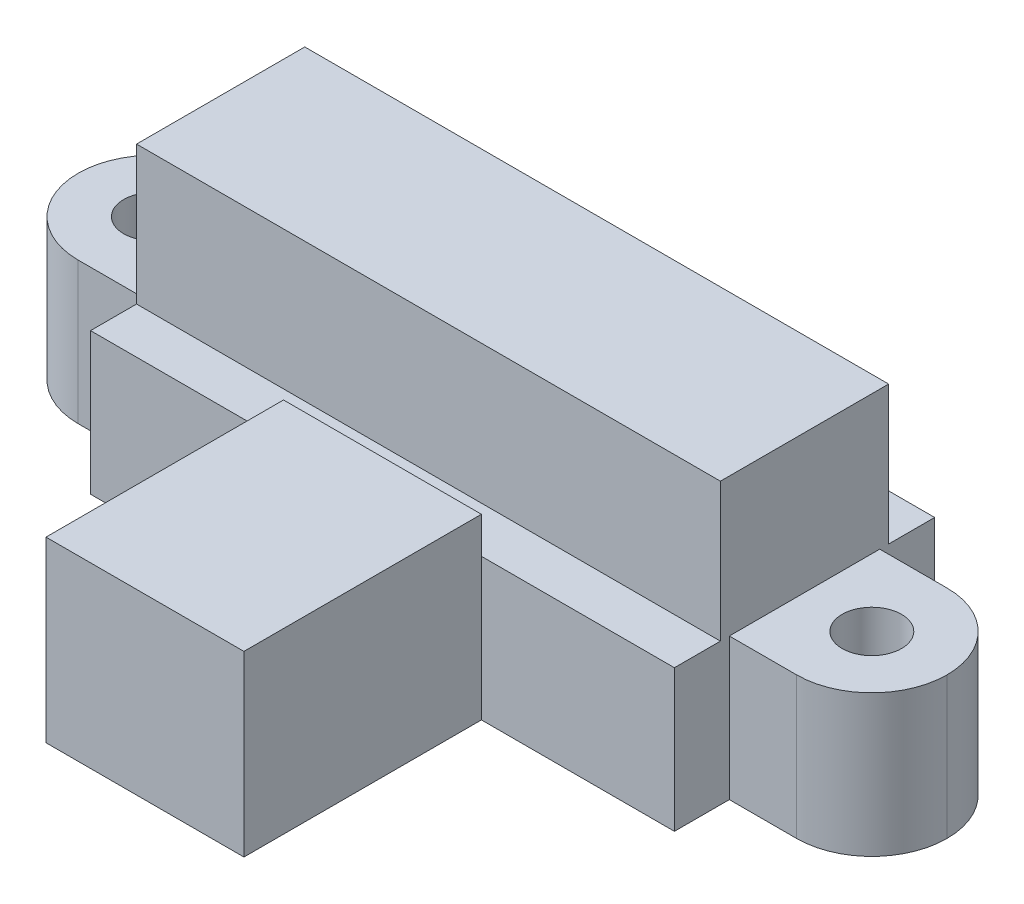
ISO-10303-21;
HEADER;
FILE_DESCRIPTION(('STEP AP214'),'2;1');
FILE_NAME('part.step','',(''),(''),'','','');
FILE_SCHEMA(('AUTOMOTIVE_DESIGN { 1 0 10303 214 1 1 1 1 }'));
ENDSEC;
DATA;
#1=APPLICATION_CONTEXT('core data for automotive mechanical design processes');
#2=APPLICATION_PROTOCOL_DEFINITION('international standard','automotive_design',2000,#1);
#3=PRODUCT_CONTEXT('',#1,'mechanical');
#4=PRODUCT('Part','Part','',(#3));
#5=PRODUCT_RELATED_PRODUCT_CATEGORY('part','',(#4));
#6=PRODUCT_DEFINITION_FORMATION('','',#4);
#7=PRODUCT_DEFINITION_CONTEXT('part definition',#1,'design');
#8=PRODUCT_DEFINITION('design','',#6,#7);
#9=PRODUCT_DEFINITION_SHAPE('','',#8);
#10=(LENGTH_UNIT() NAMED_UNIT(*) SI_UNIT(.MILLI.,.METRE.));
#11=(NAMED_UNIT(*) PLANE_ANGLE_UNIT() SI_UNIT($,.RADIAN.));
#12=(NAMED_UNIT(*) SI_UNIT($,.STERADIAN.) SOLID_ANGLE_UNIT());
#13=UNCERTAINTY_MEASURE_WITH_UNIT(LENGTH_MEASURE(1.E-05),#10,'distance_accuracy_value','');
#14=(GEOMETRIC_REPRESENTATION_CONTEXT(3) GLOBAL_UNCERTAINTY_ASSIGNED_CONTEXT((#13)) GLOBAL_UNIT_ASSIGNED_CONTEXT((#10,
#11,#12)) REPRESENTATION_CONTEXT('',''));
#15=CARTESIAN_POINT('',(0.,0.,0.));
#16=DIRECTION('',(0.,0.,1.));
#17=DIRECTION('',(1.,0.,0.));
#18=AXIS2_PLACEMENT_3D('',#15,#16,#17);
#19=CARTESIAN_POINT('',(-5.,0.,18.575));
#20=DIRECTION('',(0.,1.,0.));
#21=DIRECTION('',(0.,0.,1.));
#22=AXIS2_PLACEMENT_3D('',#19,#20,#21);
#23=PLANE('',#22);
#24=DIRECTION('',(1.,0.,0.));
#25=VECTOR('',#24,1.);
#26=CARTESIAN_POINT('',(-5.,0.,6.575));
#27=LINE('',#26,#25);
#28=CARTESIAN_POINT('',(-5.,0.,6.575));
#29=VERTEX_POINT('',#28);
#30=CARTESIAN_POINT('',(5.,0.,6.575));
#31=VERTEX_POINT('',#30);
#32=EDGE_CURVE('E105',#29,#31,#27,.T.);
#33=ORIENTED_EDGE('',*,*,#32,.T.);
#34=DIRECTION('',(0.,0.,-1.));
#35=VECTOR('',#34,1.);
#36=CARTESIAN_POINT('',(5.,0.,18.575));
#37=LINE('',#36,#35);
#38=CARTESIAN_POINT('',(5.,0.,18.575));
#39=VERTEX_POINT('',#38);
#40=EDGE_CURVE('E12',#39,#31,#37,.T.);
#41=ORIENTED_EDGE('',*,*,#40,.F.);
#42=DIRECTION('',(1.,0.,0.));
#43=VECTOR('',#42,1.);
#44=CARTESIAN_POINT('',(-5.,0.,18.575));
#45=LINE('',#44,#43);
#46=CARTESIAN_POINT('',(-5.,0.,18.575));
#47=VERTEX_POINT('',#46);
#48=EDGE_CURVE('E93',#47,#39,#45,.T.);
#49=ORIENTED_EDGE('',*,*,#48,.F.);
#50=DIRECTION('',(0.,0.,-1.));
#51=VECTOR('',#50,1.);
#52=CARTESIAN_POINT('',(-5.,0.,18.575));
#53=LINE('',#52,#51);
#54=EDGE_CURVE('E101',#47,#29,#53,.T.);
#55=ORIENTED_EDGE('',*,*,#54,.T.);
#56=EDGE_LOOP('',(#33,#41,#49,#55));
#57=FACE_BOUND('',#56,.T.);
#58=ADVANCED_FACE('F42',(#57),#23,.F.);
#59=CARTESIAN_POINT('',(5.,0.,18.575));
#60=DIRECTION('',(-1.,0.,0.));
#61=DIRECTION('',(0.,0.,1.));
#62=AXIS2_PLACEMENT_3D('',#59,#60,#61);
#63=PLANE('',#62);
#64=DIRECTION('',(0.,1.,0.));
#65=VECTOR('',#64,1.);
#66=CARTESIAN_POINT('',(5.,0.,6.575));
#67=LINE('',#66,#65);
#68=CARTESIAN_POINT('',(5.,9.,6.575));
#69=VERTEX_POINT('',#68);
#70=EDGE_CURVE('E97',#31,#69,#67,.T.);
#71=ORIENTED_EDGE('',*,*,#70,.T.);
#72=DIRECTION('',(0.,0.,-1.));
#73=VECTOR('',#72,1.);
#74=CARTESIAN_POINT('',(5.,9.,18.575));
#75=LINE('',#74,#73);
#76=CARTESIAN_POINT('',(5.,9.,18.575));
#77=VERTEX_POINT('',#76);
#78=EDGE_CURVE('E50',#77,#69,#75,.T.);
#79=ORIENTED_EDGE('',*,*,#78,.F.);
#80=DIRECTION('',(0.,1.,0.));
#81=VECTOR('',#80,1.);
#82=CARTESIAN_POINT('',(5.,0.,18.575));
#83=LINE('',#82,#81);
#84=EDGE_CURVE('E88',#39,#77,#83,.T.);
#85=ORIENTED_EDGE('',*,*,#84,.F.);
#86=ORIENTED_EDGE('',*,*,#40,.T.);
#87=EDGE_LOOP('',(#71,#79,#85,#86));
#88=FACE_BOUND('',#87,.T.);
#89=ADVANCED_FACE('F96',(#88),#63,.F.);
#90=CARTESIAN_POINT('',(5.,9.,18.575));
#91=DIRECTION('',(0.,-1.,0.));
#92=DIRECTION('',(0.,0.,-1.));
#93=AXIS2_PLACEMENT_3D('',#90,#91,#92);
#94=PLANE('',#93);
#95=DIRECTION('',(-1.,0.,0.));
#96=VECTOR('',#95,1.);
#97=CARTESIAN_POINT('',(5.,9.,6.575));
#98=LINE('',#97,#96);
#99=CARTESIAN_POINT('',(-5.,9.,6.575));
#100=VERTEX_POINT('',#99);
#101=EDGE_CURVE('E75',#69,#100,#98,.T.);
#102=ORIENTED_EDGE('',*,*,#101,.T.);
#103=DIRECTION('',(0.,0.,-1.));
#104=VECTOR('',#103,1.);
#105=CARTESIAN_POINT('',(-5.,9.,18.575));
#106=LINE('',#105,#104);
#107=CARTESIAN_POINT('',(-5.,9.,18.575));
#108=VERTEX_POINT('',#107);
#109=EDGE_CURVE('E98',#108,#100,#106,.T.);
#110=ORIENTED_EDGE('',*,*,#109,.F.);
#111=DIRECTION('',(-1.,0.,0.));
#112=VECTOR('',#111,1.);
#113=CARTESIAN_POINT('',(5.,9.,18.575));
#114=LINE('',#113,#112);
#115=EDGE_CURVE('E91',#77,#108,#114,.T.);
#116=ORIENTED_EDGE('',*,*,#115,.F.);
#117=ORIENTED_EDGE('',*,*,#78,.T.);
#118=EDGE_LOOP('',(#102,#110,#116,#117));
#119=FACE_BOUND('',#118,.T.);
#120=ADVANCED_FACE('F99',(#119),#94,.F.);
#121=CARTESIAN_POINT('',(-5.,0.,18.575));
#122=DIRECTION('',(1.,0.,0.));
#123=DIRECTION('',(0.,0.,-1.));
#124=AXIS2_PLACEMENT_3D('',#121,#122,#123);
#125=PLANE('',#124);
#126=DIRECTION('',(0.,-1.,0.));
#127=VECTOR('',#126,1.);
#128=CARTESIAN_POINT('',(-5.,0.,6.575));
#129=LINE('',#128,#127);
#130=EDGE_CURVE('E81',#100,#29,#129,.T.);
#131=ORIENTED_EDGE('',*,*,#130,.T.);
#132=ORIENTED_EDGE('',*,*,#54,.F.);
#133=DIRECTION('',(0.,-1.,0.));
#134=VECTOR('',#133,1.);
#135=CARTESIAN_POINT('',(-5.,0.,18.575));
#136=LINE('',#135,#134);
#137=EDGE_CURVE('E58',#108,#47,#136,.T.);
#138=ORIENTED_EDGE('',*,*,#137,.F.);
#139=ORIENTED_EDGE('',*,*,#109,.T.);
#140=EDGE_LOOP('',(#131,#132,#138,#139));
#141=FACE_BOUND('',#140,.T.);
#142=ADVANCED_FACE('F112',(#141),#125,.F.);
#143=CARTESIAN_POINT('',(0.,0.,18.575));
#144=DIRECTION('',(0.,0.,1.));
#145=DIRECTION('',(1.,0.,0.));
#146=AXIS2_PLACEMENT_3D('',#143,#144,#145);
#147=PLANE('',#146);
#148=ORIENTED_EDGE('',*,*,#48,.T.);
#149=ORIENTED_EDGE('',*,*,#84,.T.);
#150=ORIENTED_EDGE('',*,*,#115,.T.);
#151=ORIENTED_EDGE('',*,*,#137,.T.);
#152=EDGE_LOOP('',(#148,#149,#150,#151));
#153=FACE_BOUND('',#152,.T.);
#154=ADVANCED_FACE('F89',(#153),#147,.T.);
#155=CARTESIAN_POINT('',(0.,0.,6.575));
#156=DIRECTION('',(0.,0.,1.));
#157=DIRECTION('',(1.,0.,0.));
#158=AXIS2_PLACEMENT_3D('',#155,#156,#157);
#159=PLANE('',#158);
#160=ORIENTED_EDGE('',*,*,#32,.F.);
#161=ORIENTED_EDGE('',*,*,#130,.F.);
#162=ORIENTED_EDGE('',*,*,#101,.F.);
#163=ORIENTED_EDGE('',*,*,#70,.F.);
#164=EDGE_LOOP('',(#160,#161,#162,#163));
#165=FACE_BOUND('',#164,.T.);
#166=ADVANCED_FACE('F115',(#165),#159,.F.);
#167=CLOSED_SHELL('',(#58,#89,#120,#142,#154,#166));
#168=MANIFOLD_SOLID_BREP('B2',#167);
#169=CARTESIAN_POINT('',(0.,7.16,0.));
#170=DIRECTION('',(0.,1.,0.));
#171=DIRECTION('',(0.,0.,1.));
#172=AXIS2_PLACEMENT_3D('',#169,#170,#171);
#173=PLANE('',#172);
#174=CARTESIAN_POINT('',(18.15,7.16,0.));
#175=DIRECTION('',(0.,1.,0.));
#176=DIRECTION('',(0.,0.,1.));
#177=AXIS2_PLACEMENT_3D('',#174,#175,#176);
#178=CIRCLE('',#177,1.5);
#179=CARTESIAN_POINT('',(18.15,7.16,1.5));
#180=VERTEX_POINT('',#179);
#181=EDGE_CURVE('E378',#180,#180,#178,.T.);
#182=ORIENTED_EDGE('',*,*,#181,.F.);
#183=EDGE_LOOP('',(#182));
#184=FACE_BOUND('',#183,.T.);
#185=DIRECTION('',(0.,0.,-1.));
#186=VECTOR('',#185,1.);
#187=CARTESIAN_POINT('',(14.75,7.16,4.25));
#188=LINE('',#187,#186);
#189=CARTESIAN_POINT('',(14.75,7.16,3.8));
#190=VERTEX_POINT('',#189);
#191=CARTESIAN_POINT('',(14.75,7.16,-3.8));
#192=VERTEX_POINT('',#191);
#193=EDGE_CURVE('E40',#190,#192,#188,.T.);
#194=ORIENTED_EDGE('',*,*,#193,.F.);
#195=DIRECTION('',(1.,0.,0.));
#196=VECTOR('',#195,1.);
#197=CARTESIAN_POINT('',(21.95,7.16,3.8));
#198=LINE('',#197,#196);
#199=CARTESIAN_POINT('',(18.15,7.16,3.8));
#200=VERTEX_POINT('',#199);
#201=EDGE_CURVE('E577',#190,#200,#198,.T.);
#202=ORIENTED_EDGE('',*,*,#201,.T.);
#203=CARTESIAN_POINT('',(18.15,7.16,0.));
#204=DIRECTION('',(0.,1.,0.));
#205=DIRECTION('',(0.,0.,1.));
#206=AXIS2_PLACEMENT_3D('',#203,#204,#205);
#207=CIRCLE('',#206,3.8);
#208=CARTESIAN_POINT('',(21.95,7.16,0.));
#209=VERTEX_POINT('',#208);
#210=EDGE_CURVE('E343',#200,#209,#207,.T.);
#211=ORIENTED_EDGE('',*,*,#210,.T.);
#212=CARTESIAN_POINT('',(18.15,7.16,0.));
#213=DIRECTION('',(0.,1.,0.));
#214=DIRECTION('',(0.,0.,1.));
#215=AXIS2_PLACEMENT_3D('',#212,#213,#214);
#216=CIRCLE('',#215,3.8);
#217=CARTESIAN_POINT('',(18.15,7.16,-3.8));
#218=VERTEX_POINT('',#217);
#219=EDGE_CURVE('E471',#209,#218,#216,.T.);
#220=ORIENTED_EDGE('',*,*,#219,.T.);
#221=DIRECTION('',(-1.,0.,0.));
#222=VECTOR('',#221,1.);
#223=CARTESIAN_POINT('',(14.75,7.16,-3.8));
#224=LINE('',#223,#222);
#225=EDGE_CURVE('E328',#218,#192,#224,.T.);
#226=ORIENTED_EDGE('',*,*,#225,.T.);
#227=EDGE_LOOP('',(#194,#202,#211,#220,#226));
#228=FACE_BOUND('',#227,.T.);
#229=ADVANCED_FACE('F165',(#184,#228),#173,.T.);
#230=DIRECTION('',(1.,0.,0.));
#231=VECTOR('',#230,1.);
#232=CARTESIAN_POINT('',(-14.75,7.16,4.25));
#233=LINE('',#232,#231);
#234=CARTESIAN_POINT('',(-14.75,7.16,4.25));
#235=VERTEX_POINT('',#234);
#236=CARTESIAN_POINT('',(14.75,7.16,4.25));
#237=VERTEX_POINT('',#236);
#238=EDGE_CURVE('E186',#235,#237,#233,.T.);
#239=ORIENTED_EDGE('',*,*,#238,.F.);
#240=DIRECTION('',(0.,0.,1.));
#241=VECTOR('',#240,1.);
#242=CARTESIAN_POINT('',(-14.75,7.16,3.8));
#243=LINE('',#242,#241);
#244=CARTESIAN_POINT('',(-14.75,7.16,6.575));
#245=VERTEX_POINT('',#244);
#246=EDGE_CURVE('E348',#235,#245,#243,.T.);
#247=ORIENTED_EDGE('',*,*,#246,.T.);
#248=DIRECTION('',(1.,0.,0.));
#249=VECTOR('',#248,1.);
#250=CARTESIAN_POINT('',(-14.75,7.16,6.575));
#251=LINE('',#250,#249);
#252=CARTESIAN_POINT('',(14.75,7.16,6.575));
#253=VERTEX_POINT('',#252);
#254=EDGE_CURVE('E405',#245,#253,#251,.T.);
#255=ORIENTED_EDGE('',*,*,#254,.T.);
#256=DIRECTION('',(0.,0.,-1.));
#257=VECTOR('',#256,1.);
#258=CARTESIAN_POINT('',(14.75,7.16,6.575));
#259=LINE('',#258,#257);
#260=EDGE_CURVE('E182',#253,#237,#259,.T.);
#261=ORIENTED_EDGE('',*,*,#260,.T.);
#262=EDGE_LOOP('',(#239,#247,#255,#261));
#263=FACE_BOUND('',#262,.T.);
#264=ADVANCED_FACE('F510',(#263),#173,.T.);
#265=CARTESIAN_POINT('',(-18.15,7.16,0.));
#266=DIRECTION('',(0.,1.,0.));
#267=DIRECTION('',(0.,0.,1.));
#268=AXIS2_PLACEMENT_3D('',#265,#266,#267);
#269=CIRCLE('',#268,1.5);
#270=CARTESIAN_POINT('',(-18.15,7.16,1.5));
#271=VERTEX_POINT('',#270);
#272=EDGE_CURVE('E370',#271,#271,#269,.T.);
#273=ORIENTED_EDGE('',*,*,#272,.F.);
#274=EDGE_LOOP('',(#273));
#275=FACE_BOUND('',#274,.T.);
#276=DIRECTION('',(0.,0.,1.));
#277=VECTOR('',#276,1.);
#278=CARTESIAN_POINT('',(-14.75,7.16,4.25));
#279=LINE('',#278,#277);
#280=CARTESIAN_POINT('',(-14.75,7.16,-3.8));
#281=VERTEX_POINT('',#280);
#282=CARTESIAN_POINT('',(-14.75,7.16,3.8));
#283=VERTEX_POINT('',#282);
#284=EDGE_CURVE('E174',#281,#283,#279,.T.);
#285=ORIENTED_EDGE('',*,*,#284,.F.);
#286=DIRECTION('',(-1.,0.,0.));
#287=VECTOR('',#286,1.);
#288=CARTESIAN_POINT('',(-21.95,7.16,-3.8));
#289=LINE('',#288,#287);
#290=CARTESIAN_POINT('',(-18.15,7.16,-3.8));
#291=VERTEX_POINT('',#290);
#292=EDGE_CURVE('E349',#281,#291,#289,.T.);
#293=ORIENTED_EDGE('',*,*,#292,.T.);
#294=CARTESIAN_POINT('',(-18.15,7.16,0.));
#295=DIRECTION('',(0.,1.,0.));
#296=DIRECTION('',(0.,0.,1.));
#297=AXIS2_PLACEMENT_3D('',#294,#295,#296);
#298=CIRCLE('',#297,3.8);
#299=CARTESIAN_POINT('',(-21.95,7.16,0.));
#300=VERTEX_POINT('',#299);
#301=EDGE_CURVE('E450',#291,#300,#298,.T.);
#302=ORIENTED_EDGE('',*,*,#301,.T.);
#303=CARTESIAN_POINT('',(-18.15,7.16,0.));
#304=DIRECTION('',(0.,1.,0.));
#305=DIRECTION('',(0.,0.,1.));
#306=AXIS2_PLACEMENT_3D('',#303,#304,#305);
#307=CIRCLE('',#306,3.8);
#308=CARTESIAN_POINT('',(-18.15,7.16,3.8));
#309=VERTEX_POINT('',#308);
#310=EDGE_CURVE('E460',#300,#309,#307,.T.);
#311=ORIENTED_EDGE('',*,*,#310,.T.);
#312=DIRECTION('',(1.,0.,0.));
#313=VECTOR('',#312,1.);
#314=CARTESIAN_POINT('',(-21.95,7.16,3.8));
#315=LINE('',#314,#313);
#316=EDGE_CURVE('E346',#309,#283,#315,.T.);
#317=ORIENTED_EDGE('',*,*,#316,.T.);
#318=EDGE_LOOP('',(#285,#293,#302,#311,#317));
#319=FACE_BOUND('',#318,.T.);
#320=ADVANCED_FACE('F499',(#275,#319),#173,.T.);
#321=CARTESIAN_POINT('',(18.15,7.16,0.));
#322=DIRECTION('',(0.,1.,0.));
#323=DIRECTION('',(0.,0.,1.));
#324=AXIS2_PLACEMENT_3D('',#321,#322,#323);
#325=CYLINDRICAL_SURFACE('',#324,3.8);
#326=DIRECTION('',(0.,1.,0.));
#327=VECTOR('',#326,1.);
#328=CARTESIAN_POINT('',(18.15,7.16,3.8));
#329=LINE('',#328,#327);
#330=CARTESIAN_POINT('',(18.15,0.,3.8));
#331=VERTEX_POINT('',#330);
#332=EDGE_CURVE('E473',#331,#200,#329,.T.);
#333=ORIENTED_EDGE('',*,*,#332,.F.);
#334=CARTESIAN_POINT('',(18.15,0.,0.));
#335=DIRECTION('',(0.,1.,0.));
#336=DIRECTION('',(0.,0.,1.));
#337=AXIS2_PLACEMENT_3D('',#334,#335,#336);
#338=CIRCLE('',#337,3.8);
#339=CARTESIAN_POINT('',(21.95,0.,0.));
#340=VERTEX_POINT('',#339);
#341=EDGE_CURVE('E476',#340,#331,#338,.F.);
#342=ORIENTED_EDGE('',*,*,#341,.F.);
#343=DIRECTION('',(0.,1.,0.));
#344=VECTOR('',#343,1.);
#345=CARTESIAN_POINT('',(21.95,7.16,0.));
#346=LINE('',#345,#344);
#347=EDGE_CURVE('E462',#340,#209,#346,.T.);
#348=ORIENTED_EDGE('',*,*,#347,.T.);
#349=ORIENTED_EDGE('',*,*,#210,.F.);
#350=EDGE_LOOP('',(#333,#342,#348,#349));
#351=FACE_BOUND('',#350,.T.);
#352=ADVANCED_FACE('F167',(#351),#325,.T.);
#353=CARTESIAN_POINT('',(18.15,7.16,0.));
#354=DIRECTION('',(0.,1.,0.));
#355=DIRECTION('',(0.,0.,1.));
#356=AXIS2_PLACEMENT_3D('',#353,#354,#355);
#357=CYLINDRICAL_SURFACE('',#356,3.8);
#358=ORIENTED_EDGE('',*,*,#347,.F.);
#359=CARTESIAN_POINT('',(18.15,0.,0.));
#360=DIRECTION('',(0.,1.,0.));
#361=DIRECTION('',(0.,0.,1.));
#362=AXIS2_PLACEMENT_3D('',#359,#360,#361);
#363=CIRCLE('',#362,3.8);
#364=CARTESIAN_POINT('',(18.15,0.,-3.8));
#365=VERTEX_POINT('',#364);
#366=EDGE_CURVE('E468',#365,#340,#363,.F.);
#367=ORIENTED_EDGE('',*,*,#366,.F.);
#368=DIRECTION('',(0.,1.,0.));
#369=VECTOR('',#368,1.);
#370=CARTESIAN_POINT('',(18.15,7.16,-3.8));
#371=LINE('',#370,#369);
#372=EDGE_CURVE('E465',#218,#365,#371,.F.);
#373=ORIENTED_EDGE('',*,*,#372,.F.);
#374=ORIENTED_EDGE('',*,*,#219,.F.);
#375=EDGE_LOOP('',(#358,#367,#373,#374));
#376=FACE_BOUND('',#375,.T.);
#377=ADVANCED_FACE('F555',(#376),#357,.T.);
#378=CARTESIAN_POINT('',(-18.15,7.16,0.));
#379=DIRECTION('',(0.,1.,0.));
#380=DIRECTION('',(0.,0.,1.));
#381=AXIS2_PLACEMENT_3D('',#378,#379,#380);
#382=CYLINDRICAL_SURFACE('',#381,3.8);
#383=DIRECTION('',(0.,-1.,0.));
#384=VECTOR('',#383,1.);
#385=CARTESIAN_POINT('',(-21.95,7.16,0.));
#386=LINE('',#385,#384);
#387=CARTESIAN_POINT('',(-21.95,0.,0.));
#388=VERTEX_POINT('',#387);
#389=EDGE_CURVE('E444',#300,#388,#386,.T.);
#390=ORIENTED_EDGE('',*,*,#389,.T.);
#391=CARTESIAN_POINT('',(-18.15,0.,0.));
#392=DIRECTION('',(0.,1.,0.));
#393=DIRECTION('',(0.,0.,1.));
#394=AXIS2_PLACEMENT_3D('',#391,#392,#393);
#395=CIRCLE('',#394,3.8);
#396=CARTESIAN_POINT('',(-18.15,0.,3.8));
#397=VERTEX_POINT('',#396);
#398=EDGE_CURVE('E458',#397,#388,#395,.F.);
#399=ORIENTED_EDGE('',*,*,#398,.F.);
#400=DIRECTION('',(0.,1.,0.));
#401=VECTOR('',#400,1.);
#402=CARTESIAN_POINT('',(-18.15,7.16,3.8));
#403=LINE('',#402,#401);
#404=EDGE_CURVE('E455',#309,#397,#403,.F.);
#405=ORIENTED_EDGE('',*,*,#404,.F.);
#406=ORIENTED_EDGE('',*,*,#310,.F.);
#407=EDGE_LOOP('',(#390,#399,#405,#406));
#408=FACE_BOUND('',#407,.T.);
#409=ADVANCED_FACE('F552',(#408),#382,.T.);
#410=CARTESIAN_POINT('',(-18.15,7.16,0.));
#411=DIRECTION('',(0.,-1.,0.));
#412=DIRECTION('',(0.,0.,-1.));
#413=AXIS2_PLACEMENT_3D('',#410,#411,#412);
#414=CYLINDRICAL_SURFACE('',#413,3.8);
#415=ORIENTED_EDGE('',*,*,#389,.F.);
#416=ORIENTED_EDGE('',*,*,#301,.F.);
#417=DIRECTION('',(0.,-1.,0.));
#418=VECTOR('',#417,1.);
#419=CARTESIAN_POINT('',(-18.15,7.16,-3.8));
#420=LINE('',#419,#418);
#421=CARTESIAN_POINT('',(-18.15,0.,-3.8));
#422=VERTEX_POINT('',#421);
#423=EDGE_CURVE('E447',#422,#291,#420,.F.);
#424=ORIENTED_EDGE('',*,*,#423,.F.);
#425=CARTESIAN_POINT('',(-18.15,0.,0.));
#426=DIRECTION('',(0.,1.,0.));
#427=DIRECTION('',(0.,0.,1.));
#428=AXIS2_PLACEMENT_3D('',#425,#426,#427);
#429=CIRCLE('',#428,3.8);
#430=EDGE_CURVE('E453',#388,#422,#429,.F.);
#431=ORIENTED_EDGE('',*,*,#430,.F.);
#432=EDGE_LOOP('',(#415,#416,#424,#431));
#433=FACE_BOUND('',#432,.T.);
#434=ADVANCED_FACE('F549',(#433),#414,.T.);
#435=CARTESIAN_POINT('',(-14.75,7.16,-6.575));
#436=DIRECTION('',(0.,0.,1.));
#437=DIRECTION('',(1.,0.,0.));
#438=AXIS2_PLACEMENT_3D('',#435,#436,#437);
#439=PLANE('',#438);
#440=DIRECTION('',(-1.,0.,0.));
#441=VECTOR('',#440,1.);
#442=CARTESIAN_POINT('',(-14.75,0.,-6.575));
#443=LINE('',#442,#441);
#444=CARTESIAN_POINT('',(14.75,0.,-6.575));
#445=VERTEX_POINT('',#444);
#446=CARTESIAN_POINT('',(-14.75,0.,-6.575));
#447=VERTEX_POINT('',#446);
#448=EDGE_CURVE('E318',#445,#447,#443,.T.);
#449=ORIENTED_EDGE('',*,*,#448,.T.);
#450=DIRECTION('',(0.,-1.,0.));
#451=VECTOR('',#450,1.);
#452=CARTESIAN_POINT('',(-14.75,7.16,-6.575));
#453=LINE('',#452,#451);
#454=CARTESIAN_POINT('',(-14.75,7.16,-6.575));
#455=VERTEX_POINT('',#454);
#456=EDGE_CURVE('E361',#455,#447,#453,.T.);
#457=ORIENTED_EDGE('',*,*,#456,.F.);
#458=DIRECTION('',(-1.,0.,0.));
#459=VECTOR('',#458,1.);
#460=CARTESIAN_POINT('',(-14.75,7.16,-6.575));
#461=LINE('',#460,#459);
#462=CARTESIAN_POINT('',(14.75,7.16,-6.575));
#463=VERTEX_POINT('',#462);
#464=EDGE_CURVE('E478',#463,#455,#461,.T.);
#465=ORIENTED_EDGE('',*,*,#464,.F.);
#466=DIRECTION('',(0.,-1.,0.));
#467=VECTOR('',#466,1.);
#468=CARTESIAN_POINT('',(14.75,7.16,-6.575));
#469=LINE('',#468,#467);
#470=EDGE_CURVE('E441',#463,#445,#469,.T.);
#471=ORIENTED_EDGE('',*,*,#470,.T.);
#472=EDGE_LOOP('',(#449,#457,#465,#471));
#473=FACE_BOUND('',#472,.T.);
#474=ADVANCED_FACE('F546',(#473),#439,.F.);
#475=CARTESIAN_POINT('',(-21.95,7.16,-3.8));
#476=DIRECTION('',(0.,0.,1.));
#477=DIRECTION('',(1.,0.,0.));
#478=AXIS2_PLACEMENT_3D('',#475,#476,#477);
#479=PLANE('',#478);
#480=DIRECTION('',(-1.,0.,0.));
#481=VECTOR('',#480,1.);
#482=CARTESIAN_POINT('',(-21.95,0.,-3.8));
#483=LINE('',#482,#481);
#484=CARTESIAN_POINT('',(-14.75,0.,-3.8));
#485=VERTEX_POINT('',#484);
#486=EDGE_CURVE('E418',#485,#422,#483,.T.);
#487=ORIENTED_EDGE('',*,*,#486,.T.);
#488=ORIENTED_EDGE('',*,*,#423,.T.);
#489=ORIENTED_EDGE('',*,*,#292,.F.);
#490=DIRECTION('',(0.,-1.,0.));
#491=VECTOR('',#490,1.);
#492=CARTESIAN_POINT('',(-14.75,7.16,-3.8));
#493=LINE('',#492,#491);
#494=EDGE_CURVE('E355',#281,#485,#493,.T.);
#495=ORIENTED_EDGE('',*,*,#494,.T.);
#496=EDGE_LOOP('',(#487,#488,#489,#495));
#497=FACE_BOUND('',#496,.T.);
#498=ADVANCED_FACE('F494',(#497),#479,.F.);
#499=CARTESIAN_POINT('',(-21.95,7.16,3.8));
#500=DIRECTION('',(0.,0.,-1.));
#501=DIRECTION('',(-1.,0.,0.));
#502=AXIS2_PLACEMENT_3D('',#499,#500,#501);
#503=PLANE('',#502);
#504=ORIENTED_EDGE('',*,*,#316,.F.);
#505=ORIENTED_EDGE('',*,*,#404,.T.);
#506=DIRECTION('',(1.,0.,0.));
#507=VECTOR('',#506,1.);
#508=CARTESIAN_POINT('',(-21.95,0.,3.8));
#509=LINE('',#508,#507);
#510=CARTESIAN_POINT('',(-14.75,0.,3.8));
#511=VERTEX_POINT('',#510);
#512=EDGE_CURVE('E421',#397,#511,#509,.T.);
#513=ORIENTED_EDGE('',*,*,#512,.T.);
#514=DIRECTION('',(0.,-1.,0.));
#515=VECTOR('',#514,1.);
#516=CARTESIAN_POINT('',(-14.75,7.16,3.8));
#517=LINE('',#516,#515);
#518=EDGE_CURVE('E352',#283,#511,#517,.T.);
#519=ORIENTED_EDGE('',*,*,#518,.F.);
#520=EDGE_LOOP('',(#504,#505,#513,#519));
#521=FACE_BOUND('',#520,.T.);
#522=ADVANCED_FACE('F503',(#521),#503,.F.);
#523=CARTESIAN_POINT('',(-14.75,7.16,3.8));
#524=DIRECTION('',(1.,0.,0.));
#525=DIRECTION('',(0.,0.,-1.));
#526=AXIS2_PLACEMENT_3D('',#523,#524,#525);
#527=PLANE('',#526);
#528=DIRECTION('',(0.,0.,1.));
#529=VECTOR('',#528,1.);
#530=CARTESIAN_POINT('',(-14.75,0.,3.8));
#531=LINE('',#530,#529);
#532=CARTESIAN_POINT('',(-14.75,0.,6.575));
#533=VERTEX_POINT('',#532);
#534=EDGE_CURVE('E423',#511,#533,#531,.T.);
#535=ORIENTED_EDGE('',*,*,#534,.T.);
#536=DIRECTION('',(0.,-1.,0.));
#537=VECTOR('',#536,1.);
#538=CARTESIAN_POINT('',(-14.75,7.16,6.575));
#539=LINE('',#538,#537);
#540=EDGE_CURVE('E356',#245,#533,#539,.T.);
#541=ORIENTED_EDGE('',*,*,#540,.F.);
#542=ORIENTED_EDGE('',*,*,#246,.F.);
#543=DIRECTION('',(0.,-1.,0.));
#544=VECTOR('',#543,1.);
#545=CARTESIAN_POINT('',(-14.75,14.16,4.25));
#546=LINE('',#545,#544);
#547=CARTESIAN_POINT('',(-14.75,14.16,4.25));
#548=VERTEX_POINT('',#547);
#549=EDGE_CURVE('E320',#548,#235,#546,.T.);
#550=ORIENTED_EDGE('',*,*,#549,.F.);
#551=DIRECTION('',(0.,0.,1.));
#552=VECTOR('',#551,1.);
#553=CARTESIAN_POINT('',(-14.75,14.16,4.25));
#554=LINE('',#553,#552);
#555=CARTESIAN_POINT('',(-14.75,14.16,-4.25));
#556=VERTEX_POINT('',#555);
#557=EDGE_CURVE('E300',#556,#548,#554,.T.);
#558=ORIENTED_EDGE('',*,*,#557,.F.);
#559=DIRECTION('',(0.,-1.,0.));
#560=VECTOR('',#559,1.);
#561=CARTESIAN_POINT('',(-14.75,14.16,-4.25));
#562=LINE('',#561,#560);
#563=CARTESIAN_POINT('',(-14.75,7.16,-4.25));
#564=VERTEX_POINT('',#563);
#565=EDGE_CURVE('E297',#556,#564,#562,.T.);
#566=ORIENTED_EDGE('',*,*,#565,.T.);
#567=DIRECTION('',(0.,0.,1.));
#568=VECTOR('',#567,1.);
#569=CARTESIAN_POINT('',(-14.75,7.16,-6.575));
#570=LINE('',#569,#568);
#571=EDGE_CURVE('E366',#455,#564,#570,.T.);
#572=ORIENTED_EDGE('',*,*,#571,.F.);
#573=ORIENTED_EDGE('',*,*,#456,.T.);
#574=DIRECTION('',(0.,0.,1.));
#575=VECTOR('',#574,1.);
#576=CARTESIAN_POINT('',(-14.75,0.,-6.575));
#577=LINE('',#576,#575);
#578=EDGE_CURVE('E416',#447,#485,#577,.T.);
#579=ORIENTED_EDGE('',*,*,#578,.T.);
#580=ORIENTED_EDGE('',*,*,#494,.F.);
#581=ORIENTED_EDGE('',*,*,#284,.T.);
#582=ORIENTED_EDGE('',*,*,#518,.T.);
#583=EDGE_LOOP('',(#535,#541,#542,#550,#558,#566,#572,#573,#579,#580,#581,#582));
#584=FACE_BOUND('',#583,.T.);
#585=ADVANCED_FACE('F401',(#584),#527,.F.);
#586=CARTESIAN_POINT('',(-14.75,7.16,6.575));
#587=DIRECTION('',(0.,0.,-1.));
#588=DIRECTION('',(-1.,0.,0.));
#589=AXIS2_PLACEMENT_3D('',#586,#587,#588);
#590=PLANE('',#589);
#591=DIRECTION('',(1.,0.,0.));
#592=VECTOR('',#591,1.);
#593=CARTESIAN_POINT('',(-14.75,0.,6.575));
#594=LINE('',#593,#592);
#595=CARTESIAN_POINT('',(14.75,0.,6.575));
#596=VERTEX_POINT('',#595);
#597=EDGE_CURVE('E425',#533,#596,#594,.T.);
#598=ORIENTED_EDGE('',*,*,#597,.T.);
#599=DIRECTION('',(0.,-1.,0.));
#600=VECTOR('',#599,1.);
#601=CARTESIAN_POINT('',(14.75,7.16,6.575));
#602=LINE('',#601,#600);
#603=EDGE_CURVE('E434',#253,#596,#602,.T.);
#604=ORIENTED_EDGE('',*,*,#603,.F.);
#605=ORIENTED_EDGE('',*,*,#254,.F.);
#606=ORIENTED_EDGE('',*,*,#540,.T.);
#607=EDGE_LOOP('',(#598,#604,#605,#606));
#608=FACE_BOUND('',#607,.T.);
#609=ADVANCED_FACE('F508',(#608),#590,.F.);
#610=CARTESIAN_POINT('',(14.75,7.16,6.575));
#611=DIRECTION('',(-1.,0.,0.));
#612=DIRECTION('',(0.,0.,1.));
#613=AXIS2_PLACEMENT_3D('',#610,#611,#612);
#614=PLANE('',#613);
#615=DIRECTION('',(0.,0.,-1.));
#616=VECTOR('',#615,1.);
#617=CARTESIAN_POINT('',(14.75,0.,6.575));
#618=LINE('',#617,#616);
#619=CARTESIAN_POINT('',(14.75,0.,3.8));
#620=VERTEX_POINT('',#619);
#621=EDGE_CURVE('E427',#596,#620,#618,.T.);
#622=ORIENTED_EDGE('',*,*,#621,.T.);
#623=DIRECTION('',(0.,-1.,0.));
#624=VECTOR('',#623,1.);
#625=CARTESIAN_POINT('',(14.75,7.16,3.8));
#626=LINE('',#625,#624);
#627=EDGE_CURVE('E437',#190,#620,#626,.T.);
#628=ORIENTED_EDGE('',*,*,#627,.F.);
#629=ORIENTED_EDGE('',*,*,#193,.T.);
#630=DIRECTION('',(0.,-1.,0.));
#631=VECTOR('',#630,1.);
#632=CARTESIAN_POINT('',(14.75,7.16,-3.8));
#633=LINE('',#632,#631);
#634=CARTESIAN_POINT('',(14.75,0.,-3.8));
#635=VERTEX_POINT('',#634);
#636=EDGE_CURVE('E572',#192,#635,#633,.T.);
#637=ORIENTED_EDGE('',*,*,#636,.T.);
#638=DIRECTION('',(0.,0.,-1.));
#639=VECTOR('',#638,1.);
#640=CARTESIAN_POINT('',(14.75,0.,-6.575));
#641=LINE('',#640,#639);
#642=EDGE_CURVE('E315',#635,#445,#641,.T.);
#643=ORIENTED_EDGE('',*,*,#642,.T.);
#644=ORIENTED_EDGE('',*,*,#470,.F.);
#645=DIRECTION('',(0.,0.,-1.));
#646=VECTOR('',#645,1.);
#647=CARTESIAN_POINT('',(14.75,7.16,-6.575));
#648=LINE('',#647,#646);
#649=CARTESIAN_POINT('',(14.75,7.16,-4.25));
#650=VERTEX_POINT('',#649);
#651=EDGE_CURVE('E314',#650,#463,#648,.T.);
#652=ORIENTED_EDGE('',*,*,#651,.F.);
#653=DIRECTION('',(0.,-1.,0.));
#654=VECTOR('',#653,1.);
#655=CARTESIAN_POINT('',(14.75,14.16,-4.25));
#656=LINE('',#655,#654);
#657=CARTESIAN_POINT('',(14.75,14.16,-4.25));
#658=VERTEX_POINT('',#657);
#659=EDGE_CURVE('E295',#658,#650,#656,.T.);
#660=ORIENTED_EDGE('',*,*,#659,.F.);
#661=DIRECTION('',(0.,0.,-1.));
#662=VECTOR('',#661,1.);
#663=CARTESIAN_POINT('',(14.75,14.16,4.25));
#664=LINE('',#663,#662);
#665=CARTESIAN_POINT('',(14.75,14.16,4.25));
#666=VERTEX_POINT('',#665);
#667=EDGE_CURVE('E301',#666,#658,#664,.T.);
#668=ORIENTED_EDGE('',*,*,#667,.F.);
#669=DIRECTION('',(0.,-1.,0.));
#670=VECTOR('',#669,1.);
#671=CARTESIAN_POINT('',(14.75,14.16,4.25));
#672=LINE('',#671,#670);
#673=EDGE_CURVE('E382',#666,#237,#672,.T.);
#674=ORIENTED_EDGE('',*,*,#673,.T.);
#675=ORIENTED_EDGE('',*,*,#260,.F.);
#676=ORIENTED_EDGE('',*,*,#603,.T.);
#677=EDGE_LOOP('',(#622,#628,#629,#637,#643,#644,#652,#660,#668,#674,#675,#676));
#678=FACE_BOUND('',#677,.T.);
#679=ADVANCED_FACE('F312',(#678),#614,.F.);
#680=CARTESIAN_POINT('',(21.95,7.16,3.8));
#681=DIRECTION('',(0.,0.,-1.));
#682=DIRECTION('',(-1.,0.,0.));
#683=AXIS2_PLACEMENT_3D('',#680,#681,#682);
#684=PLANE('',#683);
#685=DIRECTION('',(1.,0.,0.));
#686=VECTOR('',#685,1.);
#687=CARTESIAN_POINT('',(21.95,0.,3.8));
#688=LINE('',#687,#686);
#689=EDGE_CURVE('E429',#620,#331,#688,.T.);
#690=ORIENTED_EDGE('',*,*,#689,.T.);
#691=ORIENTED_EDGE('',*,*,#332,.T.);
#692=ORIENTED_EDGE('',*,*,#201,.F.);
#693=ORIENTED_EDGE('',*,*,#627,.T.);
#694=EDGE_LOOP('',(#690,#691,#692,#693));
#695=FACE_BOUND('',#694,.T.);
#696=ADVANCED_FACE('F531',(#695),#684,.F.);
#697=CARTESIAN_POINT('',(14.75,7.16,-3.8));
#698=DIRECTION('',(0.,0.,1.));
#699=DIRECTION('',(1.,0.,0.));
#700=AXIS2_PLACEMENT_3D('',#697,#698,#699);
#701=PLANE('',#700);
#702=ORIENTED_EDGE('',*,*,#225,.F.);
#703=ORIENTED_EDGE('',*,*,#372,.T.);
#704=DIRECTION('',(-1.,0.,0.));
#705=VECTOR('',#704,1.);
#706=CARTESIAN_POINT('',(14.75,0.,-3.8));
#707=LINE('',#706,#705);
#708=EDGE_CURVE('E432',#365,#635,#707,.T.);
#709=ORIENTED_EDGE('',*,*,#708,.T.);
#710=ORIENTED_EDGE('',*,*,#636,.F.);
#711=EDGE_LOOP('',(#702,#703,#709,#710));
#712=FACE_BOUND('',#711,.T.);
#713=ADVANCED_FACE('F524',(#712),#701,.F.);
#714=DIRECTION('',(-1.,0.,0.));
#715=VECTOR('',#714,1.);
#716=CARTESIAN_POINT('',(-14.75,7.16,-4.25));
#717=LINE('',#716,#715);
#718=EDGE_CURVE('E337',#650,#564,#717,.T.);
#719=ORIENTED_EDGE('',*,*,#718,.F.);
#720=ORIENTED_EDGE('',*,*,#651,.T.);
#721=ORIENTED_EDGE('',*,*,#464,.T.);
#722=ORIENTED_EDGE('',*,*,#571,.T.);
#723=EDGE_LOOP('',(#719,#720,#721,#722));
#724=FACE_BOUND('',#723,.T.);
#725=ADVANCED_FACE('F483',(#724),#173,.T.);
#726=CARTESIAN_POINT('',(0.,0.,0.));
#727=DIRECTION('',(0.,1.,0.));
#728=DIRECTION('',(0.,0.,1.));
#729=AXIS2_PLACEMENT_3D('',#726,#727,#728);
#730=PLANE('',#729);
#731=CARTESIAN_POINT('',(18.15,0.,0.));
#732=DIRECTION('',(0.,1.,0.));
#733=DIRECTION('',(0.,0.,1.));
#734=AXIS2_PLACEMENT_3D('',#731,#732,#733);
#735=CIRCLE('',#734,1.5);
#736=CARTESIAN_POINT('',(18.15,0.,1.5));
#737=VERTEX_POINT('',#736);
#738=EDGE_CURVE('E169',#737,#737,#735,.T.);
#739=ORIENTED_EDGE('',*,*,#738,.T.);
#740=EDGE_LOOP('',(#739));
#741=FACE_BOUND('',#740,.T.);
#742=CARTESIAN_POINT('',(-18.15,0.,0.));
#743=DIRECTION('',(0.,1.,0.));
#744=DIRECTION('',(0.,0.,1.));
#745=AXIS2_PLACEMENT_3D('',#742,#743,#744);
#746=CIRCLE('',#745,1.5);
#747=CARTESIAN_POINT('',(-18.15,0.,1.5));
#748=VERTEX_POINT('',#747);
#749=EDGE_CURVE('E368',#748,#748,#746,.T.);
#750=ORIENTED_EDGE('',*,*,#749,.T.);
#751=EDGE_LOOP('',(#750));
#752=FACE_BOUND('',#751,.T.);
#753=ORIENTED_EDGE('',*,*,#366,.T.);
#754=ORIENTED_EDGE('',*,*,#341,.T.);
#755=ORIENTED_EDGE('',*,*,#689,.F.);
#756=ORIENTED_EDGE('',*,*,#621,.F.);
#757=ORIENTED_EDGE('',*,*,#597,.F.);
#758=ORIENTED_EDGE('',*,*,#534,.F.);
#759=ORIENTED_EDGE('',*,*,#512,.F.);
#760=ORIENTED_EDGE('',*,*,#398,.T.);
#761=ORIENTED_EDGE('',*,*,#430,.T.);
#762=ORIENTED_EDGE('',*,*,#486,.F.);
#763=ORIENTED_EDGE('',*,*,#578,.F.);
#764=ORIENTED_EDGE('',*,*,#448,.F.);
#765=ORIENTED_EDGE('',*,*,#642,.F.);
#766=ORIENTED_EDGE('',*,*,#708,.F.);
#767=EDGE_LOOP('',(#753,#754,#755,#756,#757,#758,#759,#760,#761,#762,#763,#764,#765,#766));
#768=FACE_BOUND('',#767,.T.);
#769=ADVANCED_FACE('F489',(#741,#752,#768),#730,.F.);
#770=CARTESIAN_POINT('',(-14.75,14.16,-4.25));
#771=DIRECTION('',(0.,0.,1.));
#772=DIRECTION('',(1.,0.,0.));
#773=AXIS2_PLACEMENT_3D('',#770,#771,#772);
#774=PLANE('',#773);
#775=ORIENTED_EDGE('',*,*,#718,.T.);
#776=ORIENTED_EDGE('',*,*,#565,.F.);
#777=DIRECTION('',(-1.,0.,0.));
#778=VECTOR('',#777,1.);
#779=CARTESIAN_POINT('',(-14.75,14.16,-4.25));
#780=LINE('',#779,#778);
#781=EDGE_CURVE('E290',#658,#556,#780,.T.);
#782=ORIENTED_EDGE('',*,*,#781,.F.);
#783=ORIENTED_EDGE('',*,*,#659,.T.);
#784=EDGE_LOOP('',(#775,#776,#782,#783));
#785=FACE_BOUND('',#784,.T.);
#786=ADVANCED_FACE('F293',(#785),#774,.F.);
#787=CARTESIAN_POINT('',(-14.75,14.16,4.25));
#788=DIRECTION('',(0.,0.,-1.));
#789=DIRECTION('',(-1.,0.,0.));
#790=AXIS2_PLACEMENT_3D('',#787,#788,#789);
#791=PLANE('',#790);
#792=ORIENTED_EDGE('',*,*,#238,.T.);
#793=ORIENTED_EDGE('',*,*,#673,.F.);
#794=DIRECTION('',(1.,0.,0.));
#795=VECTOR('',#794,1.);
#796=CARTESIAN_POINT('',(-14.75,14.16,4.25));
#797=LINE('',#796,#795);
#798=EDGE_CURVE('E306',#548,#666,#797,.T.);
#799=ORIENTED_EDGE('',*,*,#798,.F.);
#800=ORIENTED_EDGE('',*,*,#549,.T.);
#801=EDGE_LOOP('',(#792,#793,#799,#800));
#802=FACE_BOUND('',#801,.T.);
#803=ADVANCED_FACE('F399',(#802),#791,.F.);
#804=CARTESIAN_POINT('',(0.,14.16,0.));
#805=DIRECTION('',(0.,-1.,0.));
#806=DIRECTION('',(0.,0.,-1.));
#807=AXIS2_PLACEMENT_3D('',#804,#805,#806);
#808=PLANE('',#807);
#809=ORIENTED_EDGE('',*,*,#667,.T.);
#810=ORIENTED_EDGE('',*,*,#781,.T.);
#811=ORIENTED_EDGE('',*,*,#557,.T.);
#812=ORIENTED_EDGE('',*,*,#798,.T.);
#813=EDGE_LOOP('',(#809,#810,#811,#812));
#814=FACE_BOUND('',#813,.T.);
#815=ADVANCED_FACE('F304',(#814),#808,.F.);
#816=CARTESIAN_POINT('',(-18.15,-1.84,0.));
#817=DIRECTION('',(0.,1.,0.));
#818=DIRECTION('',(0.,0.,1.));
#819=AXIS2_PLACEMENT_3D('',#816,#817,#818);
#820=CYLINDRICAL_SURFACE('',#819,1.5);
#821=ORIENTED_EDGE('',*,*,#272,.T.);
#822=EDGE_LOOP('',(#821));
#823=FACE_BOUND('',#822,.T.);
#824=ORIENTED_EDGE('',*,*,#749,.F.);
#825=EDGE_LOOP('',(#824));
#826=FACE_BOUND('',#825,.T.);
#827=ADVANCED_FACE('F604',(#823,#826),#820,.F.);
#828=CARTESIAN_POINT('',(18.15,-1.84,0.));
#829=DIRECTION('',(0.,1.,0.));
#830=DIRECTION('',(0.,0.,1.));
#831=AXIS2_PLACEMENT_3D('',#828,#829,#830);
#832=CYLINDRICAL_SURFACE('',#831,1.5);
#833=ORIENTED_EDGE('',*,*,#181,.T.);
#834=EDGE_LOOP('',(#833));
#835=FACE_BOUND('',#834,.T.);
#836=ORIENTED_EDGE('',*,*,#738,.F.);
#837=EDGE_LOOP('',(#836));
#838=FACE_BOUND('',#837,.T.);
#839=ADVANCED_FACE('F609',(#835,#838),#832,.F.);
#840=CLOSED_SHELL('',(#229,#264,#320,#352,#377,#409,#434,#474,#498,#522,#585,#609,#679,#696,
#713,#725,#769,#786,#803,#815,#827,#839));
#841=MANIFOLD_SOLID_BREP('B6',#840);
#842=ADVANCED_BREP_SHAPE_REPRESENTATION('',(#18,#168,#841),#14);
#843=SHAPE_DEFINITION_REPRESENTATION(#9,#842);
ENDSEC;
END-ISO-10303-21;
